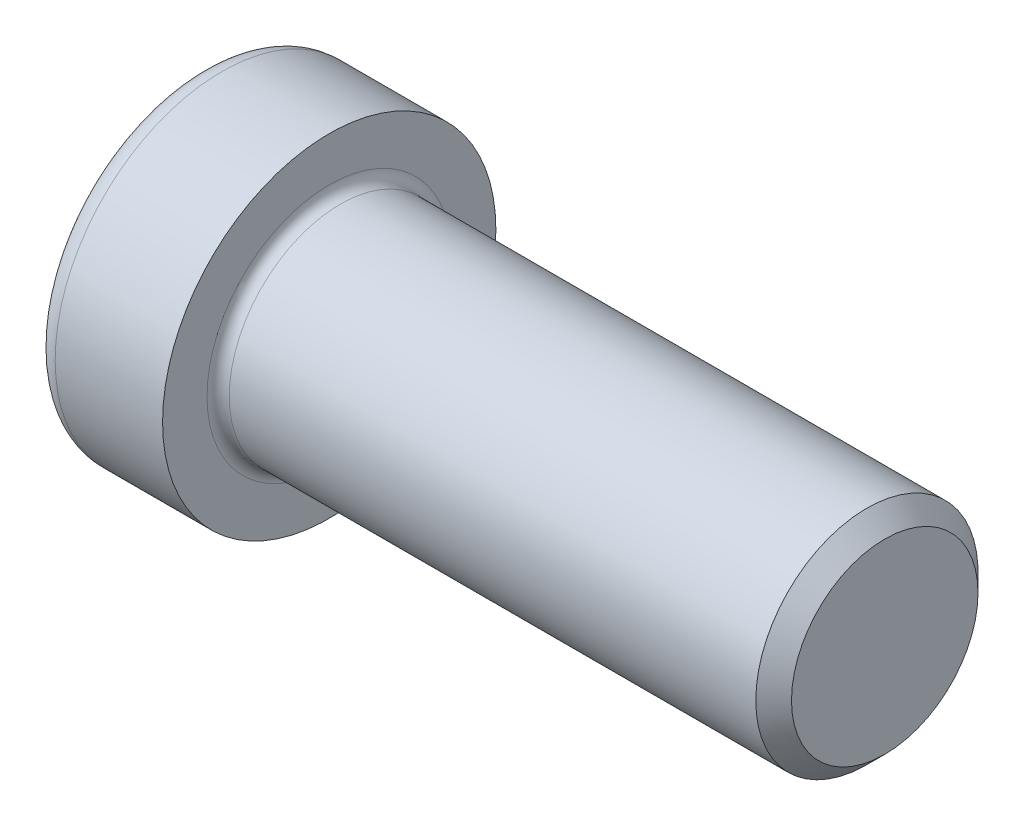
ISO-10303-21;
HEADER;
FILE_DESCRIPTION(('STEP AP214'),'2;1');
FILE_NAME('part.step','',(''),(''),'','','');
FILE_SCHEMA(('AUTOMOTIVE_DESIGN { 1 0 10303 214 1 1 1 1 }'));
ENDSEC;
DATA;
#1=APPLICATION_CONTEXT('core data for automotive mechanical design processes');
#2=APPLICATION_PROTOCOL_DEFINITION('international standard','automotive_design',2000,#1);
#3=PRODUCT_CONTEXT('',#1,'mechanical');
#4=PRODUCT('Part','Part','',(#3));
#5=PRODUCT_RELATED_PRODUCT_CATEGORY('part','',(#4));
#6=PRODUCT_DEFINITION_FORMATION('','',#4);
#7=PRODUCT_DEFINITION_CONTEXT('part definition',#1,'design');
#8=PRODUCT_DEFINITION('design','',#6,#7);
#9=PRODUCT_DEFINITION_SHAPE('','',#8);
#10=(LENGTH_UNIT() NAMED_UNIT(*) SI_UNIT(.MILLI.,.METRE.));
#11=(NAMED_UNIT(*) PLANE_ANGLE_UNIT() SI_UNIT($,.RADIAN.));
#12=(NAMED_UNIT(*) SI_UNIT($,.STERADIAN.) SOLID_ANGLE_UNIT());
#13=UNCERTAINTY_MEASURE_WITH_UNIT(LENGTH_MEASURE(1.E-05),#10,'distance_accuracy_value','');
#14=(GEOMETRIC_REPRESENTATION_CONTEXT(3) GLOBAL_UNCERTAINTY_ASSIGNED_CONTEXT((#13)) GLOBAL_UNIT_ASSIGNED_CONTEXT((#10,
#11,#12)) REPRESENTATION_CONTEXT('',''));
#15=CARTESIAN_POINT('',(0.,0.,0.));
#16=DIRECTION('',(0.,0.,1.));
#17=DIRECTION('',(1.,0.,0.));
#18=AXIS2_PLACEMENT_3D('',#15,#16,#17);
#19=CARTESIAN_POINT('',(0.,0.,0.));
#20=DIRECTION('',(-1.,0.,0.));
#21=DIRECTION('',(0.,0.,1.));
#22=AXIS2_PLACEMENT_3D('',#19,#20,#21);
#23=PLANE('',#22);
#24=DIRECTION('',(0.,-0.499999999999998,0.86602540378444));
#25=VECTOR('',#24,1.);
#26=CARTESIAN_POINT('',(0.,4.61880215351701,0.));
#27=LINE('',#26,#25);
#28=CARTESIAN_POINT('',(0.,4.61880215351701,0.));
#29=VERTEX_POINT('',#28);
#30=CARTESIAN_POINT('',(0.,2.30940107675852,3.99999999999999));
#31=VERTEX_POINT('',#30);
#32=EDGE_CURVE('E412',#29,#31,#27,.T.);
#33=ORIENTED_EDGE('',*,*,#32,.T.);
#34=DIRECTION('',(0.,1.,0.));
#35=VECTOR('',#34,1.);
#36=CARTESIAN_POINT('',(0.,-2.30940107675849,4.));
#37=LINE('',#36,#35);
#38=CARTESIAN_POINT('',(0.,-2.30940107675849,4.));
#39=VERTEX_POINT('',#38);
#40=EDGE_CURVE('E150',#39,#31,#37,.T.);
#41=ORIENTED_EDGE('',*,*,#40,.F.);
#42=DIRECTION('',(0.,-0.500000000000001,-0.866025403784438));
#43=VECTOR('',#42,1.);
#44=CARTESIAN_POINT('',(0.,-2.30940107675849,4.));
#45=LINE('',#44,#43);
#46=CARTESIAN_POINT('',(0.,-4.618802153517,0.));
#47=VERTEX_POINT('',#46);
#48=EDGE_CURVE('E417',#39,#47,#45,.T.);
#49=ORIENTED_EDGE('',*,*,#48,.T.);
#50=DIRECTION('',(0.,0.499999999999998,-0.86602540378444));
#51=VECTOR('',#50,1.);
#52=CARTESIAN_POINT('',(0.,-4.618802153517,0.));
#53=LINE('',#52,#51);
#54=CARTESIAN_POINT('',(0.,-2.3094010767585,-4.));
#55=VERTEX_POINT('',#54);
#56=EDGE_CURVE('E421',#47,#55,#53,.T.);
#57=ORIENTED_EDGE('',*,*,#56,.T.);
#58=DIRECTION('',(0.,-1.,0.));
#59=VECTOR('',#58,1.);
#60=CARTESIAN_POINT('',(0.,2.3094010767585,-4.00000000000001));
#61=LINE('',#60,#59);
#62=CARTESIAN_POINT('',(0.,2.3094010767585,-4.00000000000001));
#63=VERTEX_POINT('',#62);
#64=EDGE_CURVE('E425',#63,#55,#61,.T.);
#65=ORIENTED_EDGE('',*,*,#64,.F.);
#66=DIRECTION('',(0.,-0.500000000000001,-0.866025403784438));
#67=VECTOR('',#66,1.);
#68=CARTESIAN_POINT('',(0.,4.61880215351701,0.));
#69=LINE('',#68,#67);
#70=EDGE_CURVE('E145',#29,#63,#69,.T.);
#71=ORIENTED_EDGE('',*,*,#70,.F.);
#72=EDGE_LOOP('',(#33,#41,#49,#57,#65,#71));
#73=FACE_BOUND('',#72,.T.);
#74=CARTESIAN_POINT('',(0.,0.,0.));
#75=DIRECTION('',(-1.,0.,0.));
#76=DIRECTION('',(0.,0.,1.));
#77=AXIS2_PLACEMENT_3D('',#74,#75,#76);
#78=CIRCLE('',#77,7.8);
#79=CARTESIAN_POINT('',(0.,0.,7.8));
#80=VERTEX_POINT('',#79);
#81=EDGE_CURVE('E60',#80,#80,#78,.T.);
#82=ORIENTED_EDGE('',*,*,#81,.T.);
#83=EDGE_LOOP('',(#82));
#84=FACE_BOUND('',#83,.T.);
#85=ADVANCED_FACE('F51',(#73,#84),#23,.T.);
#86=CARTESIAN_POINT('',(37.,5.036,0.));
#87=DIRECTION('',(1.,0.,0.));
#88=DIRECTION('',(0.,0.,-1.));
#89=AXIS2_PLACEMENT_3D('',#86,#87,#88);
#90=PLANE('',#89);
#91=CARTESIAN_POINT('',(37.,0.,0.));
#92=DIRECTION('',(-1.,0.,0.));
#93=DIRECTION('',(0.,0.,1.));
#94=AXIS2_PLACEMENT_3D('',#91,#92,#93);
#95=CIRCLE('',#94,5.036);
#96=CARTESIAN_POINT('',(37.,0.,5.036));
#97=VERTEX_POINT('',#96);
#98=EDGE_CURVE('E175',#97,#97,#95,.T.);
#99=ORIENTED_EDGE('',*,*,#98,.F.);
#100=EDGE_LOOP('',(#99));
#101=FACE_BOUND('',#100,.T.);
#102=ADVANCED_FACE('F204',(#101),#90,.T.);
#103=CARTESIAN_POINT('',(37.,0.,0.));
#104=DIRECTION('',(-1.,0.,0.));
#105=DIRECTION('',(0.,0.,1.));
#106=AXIS2_PLACEMENT_3D('',#103,#104,#105);
#107=CONICAL_SURFACE('',#106,5.036,0.785398163397072);
#108=CARTESIAN_POINT('',(36.0359999999996,0.,0.));
#109=DIRECTION('',(-1.,0.,0.));
#110=DIRECTION('',(0.,0.,1.));
#111=AXIS2_PLACEMENT_3D('',#108,#109,#110);
#112=CIRCLE('',#111,5.99999999999963);
#113=CARTESIAN_POINT('',(36.0359999999996,0.,5.99999999999963));
#114=VERTEX_POINT('',#113);
#115=EDGE_CURVE('E171',#114,#114,#112,.T.);
#116=ORIENTED_EDGE('',*,*,#115,.F.);
#117=EDGE_LOOP('',(#116));
#118=FACE_BOUND('',#117,.T.);
#119=ORIENTED_EDGE('',*,*,#98,.T.);
#120=EDGE_LOOP('',(#119));
#121=FACE_BOUND('',#120,.T.);
#122=ADVANCED_FACE('F210',(#118,#121),#107,.T.);
#123=CARTESIAN_POINT('',(-31.75,0.,0.));
#124=DIRECTION('',(-1.,0.,0.));
#125=DIRECTION('',(0.,0.,1.));
#126=AXIS2_PLACEMENT_3D('',#123,#124,#125);
#127=CYLINDRICAL_SURFACE('',#126,5.99999999999981);
#128=CARTESIAN_POINT('',(7.6,0.,0.));
#129=DIRECTION('',(1.,0.,0.));
#130=DIRECTION('',(0.,0.,-1.));
#131=AXIS2_PLACEMENT_3D('',#128,#129,#130);
#132=CIRCLE('',#131,5.99999999999981);
#133=CARTESIAN_POINT('',(7.6,0.,-5.99999999999981));
#134=VERTEX_POINT('',#133);
#135=EDGE_CURVE('E183',#134,#134,#132,.T.);
#136=ORIENTED_EDGE('',*,*,#135,.T.);
#137=EDGE_LOOP('',(#136));
#138=FACE_BOUND('',#137,.T.);
#139=ORIENTED_EDGE('',*,*,#115,.T.);
#140=EDGE_LOOP('',(#139));
#141=FACE_BOUND('',#140,.T.);
#142=ADVANCED_FACE('F222',(#138,#141),#127,.T.);
#143=CARTESIAN_POINT('',(7.,9.,0.));
#144=DIRECTION('',(1.,0.,0.));
#145=DIRECTION('',(0.,0.,-1.));
#146=AXIS2_PLACEMENT_3D('',#143,#144,#145);
#147=PLANE('',#146);
#148=CARTESIAN_POINT('',(7.,0.,0.));
#149=DIRECTION('',(1.,0.,0.));
#150=DIRECTION('',(0.,0.,-1.));
#151=AXIS2_PLACEMENT_3D('',#148,#149,#150);
#152=CIRCLE('',#151,6.59999999999981);
#153=CARTESIAN_POINT('',(7.,0.,-6.59999999999981));
#154=VERTEX_POINT('',#153);
#155=EDGE_CURVE('E179',#154,#154,#152,.F.);
#156=ORIENTED_EDGE('',*,*,#155,.T.);
#157=EDGE_LOOP('',(#156));
#158=FACE_BOUND('',#157,.T.);
#159=CARTESIAN_POINT('',(7.,0.,0.));
#160=DIRECTION('',(-1.,0.,0.));
#161=DIRECTION('',(0.,0.,1.));
#162=AXIS2_PLACEMENT_3D('',#159,#160,#161);
#163=CIRCLE('',#162,9.);
#164=CARTESIAN_POINT('',(7.,0.,9.));
#165=VERTEX_POINT('',#164);
#166=EDGE_CURVE('E166',#165,#165,#163,.T.);
#167=ORIENTED_EDGE('',*,*,#166,.F.);
#168=EDGE_LOOP('',(#167));
#169=FACE_BOUND('',#168,.T.);
#170=ADVANCED_FACE('F218',(#158,#169),#147,.T.);
#171=CARTESIAN_POINT('',(-31.75,0.,0.));
#172=DIRECTION('',(-1.,0.,0.));
#173=DIRECTION('',(0.,0.,1.));
#174=AXIS2_PLACEMENT_3D('',#171,#172,#173);
#175=CYLINDRICAL_SURFACE('',#174,9.);
#176=CARTESIAN_POINT('',(1.2,0.,0.));
#177=DIRECTION('',(-1.,0.,0.));
#178=DIRECTION('',(0.,0.,1.));
#179=AXIS2_PLACEMENT_3D('',#176,#177,#178);
#180=CIRCLE('',#179,9.);
#181=CARTESIAN_POINT('',(1.2,0.,9.));
#182=VERTEX_POINT('',#181);
#183=EDGE_CURVE('E11',#182,#182,#180,.F.);
#184=ORIENTED_EDGE('',*,*,#183,.T.);
#185=EDGE_LOOP('',(#184));
#186=FACE_BOUND('',#185,.T.);
#187=ORIENTED_EDGE('',*,*,#166,.T.);
#188=EDGE_LOOP('',(#187));
#189=FACE_BOUND('',#188,.T.);
#190=ADVANCED_FACE('F200',(#186,#189),#175,.T.);
#191=CARTESIAN_POINT('',(7.6,0.,0.));
#192=DIRECTION('',(1.,0.,0.));
#193=DIRECTION('',(0.,0.,-1.));
#194=AXIS2_PLACEMENT_3D('',#191,#192,#193);
#195=TOROIDAL_SURFACE('',#194,6.59999999999981,0.6);
#196=ORIENTED_EDGE('',*,*,#135,.F.);
#197=EDGE_LOOP('',(#196));
#198=FACE_BOUND('',#197,.T.);
#199=ORIENTED_EDGE('',*,*,#155,.F.);
#200=EDGE_LOOP('',(#199));
#201=FACE_BOUND('',#200,.T.);
#202=ADVANCED_FACE('F193',(#198,#201),#195,.F.);
#203=CARTESIAN_POINT('',(1.2,0.,0.));
#204=DIRECTION('',(-1.,0.,0.));
#205=DIRECTION('',(0.,0.,1.));
#206=AXIS2_PLACEMENT_3D('',#203,#204,#205);
#207=TOROIDAL_SURFACE('',#206,7.8,1.2);
#208=ORIENTED_EDGE('',*,*,#183,.F.);
#209=EDGE_LOOP('',(#208));
#210=FACE_BOUND('',#209,.T.);
#211=ORIENTED_EDGE('',*,*,#81,.F.);
#212=EDGE_LOOP('',(#211));
#213=FACE_BOUND('',#212,.T.);
#214=ADVANCED_FACE('F53',(#210,#213),#207,.T.);
#215=CARTESIAN_POINT('',(5.,4.61880215351701,0.));
#216=DIRECTION('',(0.,-0.86602540378444,-0.499999999999998));
#217=DIRECTION('',(0.,0.499999999999998,-0.86602540378444));
#218=AXIS2_PLACEMENT_3D('',#215,#216,#217);
#219=PLANE('',#218);
#220=ORIENTED_EDGE('',*,*,#32,.F.);
#221=DIRECTION('',(-1.,0.,0.));
#222=VECTOR('',#221,1.);
#223=CARTESIAN_POINT('',(5.,4.61880215351701,0.));
#224=LINE('',#223,#222);
#225=CARTESIAN_POINT('',(5.,4.61880215351701,0.));
#226=VERTEX_POINT('',#225);
#227=EDGE_CURVE('E398',#226,#29,#224,.T.);
#228=ORIENTED_EDGE('',*,*,#227,.F.);
#229=DIRECTION('',(0.,-0.499999999999998,0.86602540378444));
#230=VECTOR('',#229,1.);
#231=CARTESIAN_POINT('',(5.,4.61880215351701,0.));
#232=LINE('',#231,#230);
#233=CARTESIAN_POINT('',(5.,3.46410161513776,1.99999999999999));
#234=VERTEX_POINT('',#233);
#235=EDGE_CURVE('E136',#226,#234,#232,.T.);
#236=ORIENTED_EDGE('',*,*,#235,.T.);
#237=CARTESIAN_POINT('',(5.,2.30940107675852,3.99999999999999));
#238=VERTEX_POINT('',#237);
#239=EDGE_CURVE('E126',#234,#238,#232,.T.);
#240=ORIENTED_EDGE('',*,*,#239,.T.);
#241=DIRECTION('',(-1.,0.,0.));
#242=VECTOR('',#241,1.);
#243=CARTESIAN_POINT('',(5.,2.30940107675852,3.99999999999999));
#244=LINE('',#243,#242);
#245=EDGE_CURVE('E141',#238,#31,#244,.T.);
#246=ORIENTED_EDGE('',*,*,#245,.T.);
#247=EDGE_LOOP('',(#220,#228,#236,#240,#246));
#248=FACE_BOUND('',#247,.T.);
#249=ADVANCED_FACE('F140',(#248),#219,.T.);
#250=CARTESIAN_POINT('',(5.,-2.30940107675849,4.));
#251=DIRECTION('',(0.,0.,1.));
#252=DIRECTION('',(0.,-1.,0.));
#253=AXIS2_PLACEMENT_3D('',#250,#251,#252);
#254=PLANE('',#253);
#255=ORIENTED_EDGE('',*,*,#40,.T.);
#256=ORIENTED_EDGE('',*,*,#245,.F.);
#257=DIRECTION('',(0.,1.,0.));
#258=VECTOR('',#257,1.);
#259=CARTESIAN_POINT('',(5.,-2.30940107675849,4.));
#260=LINE('',#259,#258);
#261=CARTESIAN_POINT('',(5.,0.,3.99999999999999));
#262=VERTEX_POINT('',#261);
#263=EDGE_CURVE('E123',#262,#238,#260,.T.);
#264=ORIENTED_EDGE('',*,*,#263,.F.);
#265=CARTESIAN_POINT('',(5.,-2.30940107675849,4.));
#266=VERTEX_POINT('',#265);
#267=EDGE_CURVE('E135',#266,#262,#260,.T.);
#268=ORIENTED_EDGE('',*,*,#267,.F.);
#269=DIRECTION('',(-1.,0.,0.));
#270=VECTOR('',#269,1.);
#271=CARTESIAN_POINT('',(5.,-2.30940107675849,4.));
#272=LINE('',#271,#270);
#273=EDGE_CURVE('E153',#266,#39,#272,.T.);
#274=ORIENTED_EDGE('',*,*,#273,.T.);
#275=EDGE_LOOP('',(#255,#256,#264,#268,#274));
#276=FACE_BOUND('',#275,.T.);
#277=ADVANCED_FACE('F147',(#276),#254,.F.);
#278=CARTESIAN_POINT('',(5.,-2.30940107675849,4.));
#279=DIRECTION('',(0.,0.866025403784438,-0.500000000000001));
#280=DIRECTION('',(0.,0.500000000000001,0.866025403784438));
#281=AXIS2_PLACEMENT_3D('',#278,#279,#280);
#282=PLANE('',#281);
#283=ORIENTED_EDGE('',*,*,#48,.F.);
#284=ORIENTED_EDGE('',*,*,#273,.F.);
#285=DIRECTION('',(0.,-0.500000000000001,-0.866025403784438));
#286=VECTOR('',#285,1.);
#287=CARTESIAN_POINT('',(5.,-2.30940107675849,4.));
#288=LINE('',#287,#286);
#289=CARTESIAN_POINT('',(5.,-3.46410161513774,2.));
#290=VERTEX_POINT('',#289);
#291=EDGE_CURVE('E460',#266,#290,#288,.T.);
#292=ORIENTED_EDGE('',*,*,#291,.T.);
#293=CARTESIAN_POINT('',(5.,-4.618802153517,0.));
#294=VERTEX_POINT('',#293);
#295=EDGE_CURVE('E440',#290,#294,#288,.T.);
#296=ORIENTED_EDGE('',*,*,#295,.T.);
#297=DIRECTION('',(-1.,0.,0.));
#298=VECTOR('',#297,1.);
#299=CARTESIAN_POINT('',(5.,-4.618802153517,0.));
#300=LINE('',#299,#298);
#301=EDGE_CURVE('E161',#294,#47,#300,.T.);
#302=ORIENTED_EDGE('',*,*,#301,.T.);
#303=EDGE_LOOP('',(#283,#284,#292,#296,#302));
#304=FACE_BOUND('',#303,.T.);
#305=ADVANCED_FACE('F287',(#304),#282,.T.);
#306=CARTESIAN_POINT('',(5.,-4.618802153517,0.));
#307=DIRECTION('',(0.,0.86602540378444,0.499999999999998));
#308=DIRECTION('',(0.,-0.499999999999998,0.86602540378444));
#309=AXIS2_PLACEMENT_3D('',#306,#307,#308);
#310=PLANE('',#309);
#311=ORIENTED_EDGE('',*,*,#56,.F.);
#312=ORIENTED_EDGE('',*,*,#301,.F.);
#313=DIRECTION('',(0.,0.499999999999998,-0.86602540378444));
#314=VECTOR('',#313,1.);
#315=CARTESIAN_POINT('',(5.,-4.618802153517,0.));
#316=LINE('',#315,#314);
#317=CARTESIAN_POINT('',(5.,-3.46410161513776,-1.99999999999999));
#318=VERTEX_POINT('',#317);
#319=EDGE_CURVE('E407',#294,#318,#316,.T.);
#320=ORIENTED_EDGE('',*,*,#319,.T.);
#321=CARTESIAN_POINT('',(5.,-2.3094010767585,-4.));
#322=VERTEX_POINT('',#321);
#323=EDGE_CURVE('E458',#318,#322,#316,.T.);
#324=ORIENTED_EDGE('',*,*,#323,.T.);
#325=DIRECTION('',(-1.,0.,0.));
#326=VECTOR('',#325,1.);
#327=CARTESIAN_POINT('',(5.,-2.3094010767585,-4.));
#328=LINE('',#327,#326);
#329=EDGE_CURVE('E397',#322,#55,#328,.T.);
#330=ORIENTED_EDGE('',*,*,#329,.T.);
#331=EDGE_LOOP('',(#311,#312,#320,#324,#330));
#332=FACE_BOUND('',#331,.T.);
#333=ADVANCED_FACE('F295',(#332),#310,.T.);
#334=CARTESIAN_POINT('',(5.,2.3094010767585,-4.00000000000001));
#335=DIRECTION('',(0.,0.,-1.));
#336=DIRECTION('',(0.,1.,0.));
#337=AXIS2_PLACEMENT_3D('',#334,#335,#336);
#338=PLANE('',#337);
#339=ORIENTED_EDGE('',*,*,#64,.T.);
#340=ORIENTED_EDGE('',*,*,#329,.F.);
#341=DIRECTION('',(0.,-1.,0.));
#342=VECTOR('',#341,1.);
#343=CARTESIAN_POINT('',(5.,2.3094010767585,-4.00000000000001));
#344=LINE('',#343,#342);
#345=CARTESIAN_POINT('',(5.,0.,-4.));
#346=VERTEX_POINT('',#345);
#347=EDGE_CURVE('E401',#346,#322,#344,.T.);
#348=ORIENTED_EDGE('',*,*,#347,.F.);
#349=CARTESIAN_POINT('',(5.,2.3094010767585,-4.00000000000001));
#350=VERTEX_POINT('',#349);
#351=EDGE_CURVE('E67',#350,#346,#344,.T.);
#352=ORIENTED_EDGE('',*,*,#351,.F.);
#353=DIRECTION('',(-1.,0.,0.));
#354=VECTOR('',#353,1.);
#355=CARTESIAN_POINT('',(5.,2.3094010767585,-4.00000000000001));
#356=LINE('',#355,#354);
#357=EDGE_CURVE('E393',#350,#63,#356,.T.);
#358=ORIENTED_EDGE('',*,*,#357,.T.);
#359=EDGE_LOOP('',(#339,#340,#348,#352,#358));
#360=FACE_BOUND('',#359,.T.);
#361=ADVANCED_FACE('F304',(#360),#338,.F.);
#362=CARTESIAN_POINT('',(5.,4.61880215351701,0.));
#363=DIRECTION('',(0.,0.866025403784438,-0.500000000000001));
#364=DIRECTION('',(0.,0.500000000000001,0.866025403784438));
#365=AXIS2_PLACEMENT_3D('',#362,#363,#364);
#366=PLANE('',#365);
#367=ORIENTED_EDGE('',*,*,#70,.T.);
#368=ORIENTED_EDGE('',*,*,#357,.F.);
#369=DIRECTION('',(0.,-0.500000000000001,-0.866025403784438));
#370=VECTOR('',#369,1.);
#371=CARTESIAN_POINT('',(5.,4.61880215351701,0.));
#372=LINE('',#371,#370);
#373=CARTESIAN_POINT('',(5.,3.46410161513776,-2.00000000000001));
#374=VERTEX_POINT('',#373);
#375=EDGE_CURVE('E382',#374,#350,#372,.T.);
#376=ORIENTED_EDGE('',*,*,#375,.F.);
#377=EDGE_CURVE('E389',#226,#374,#372,.T.);
#378=ORIENTED_EDGE('',*,*,#377,.F.);
#379=ORIENTED_EDGE('',*,*,#227,.T.);
#380=EDGE_LOOP('',(#367,#368,#376,#378,#379));
#381=FACE_BOUND('',#380,.T.);
#382=ADVANCED_FACE('F313',(#381),#366,.F.);
#383=CARTESIAN_POINT('',(5.,6.9282032302755,-4.00000000000001));
#384=DIRECTION('',(1.,0.,0.));
#385=DIRECTION('',(0.,0.,-1.));
#386=AXIS2_PLACEMENT_3D('',#383,#384,#385);
#387=PLANE('',#386);
#388=ORIENTED_EDGE('',*,*,#347,.T.);
#389=ORIENTED_EDGE('',*,*,#323,.F.);
#390=CARTESIAN_POINT('',(5.,0.,0.));
#391=DIRECTION('',(-1.,0.,0.));
#392=DIRECTION('',(0.,0.,1.));
#393=AXIS2_PLACEMENT_3D('',#390,#391,#392);
#394=CIRCLE('',#393,4.);
#395=EDGE_CURVE('E449',#346,#318,#394,.T.);
#396=ORIENTED_EDGE('',*,*,#395,.F.);
#397=EDGE_LOOP('',(#388,#389,#396));
#398=FACE_BOUND('',#397,.T.);
#399=ADVANCED_FACE('F322',(#398),#387,.F.);
#400=ORIENTED_EDGE('',*,*,#319,.F.);
#401=ORIENTED_EDGE('',*,*,#295,.F.);
#402=EDGE_CURVE('E159',#318,#290,#394,.T.);
#403=ORIENTED_EDGE('',*,*,#402,.F.);
#404=EDGE_LOOP('',(#400,#401,#403));
#405=FACE_BOUND('',#404,.T.);
#406=ADVANCED_FACE('F331',(#405),#387,.F.);
#407=ORIENTED_EDGE('',*,*,#291,.F.);
#408=ORIENTED_EDGE('',*,*,#267,.T.);
#409=EDGE_CURVE('E152',#290,#262,#394,.T.);
#410=ORIENTED_EDGE('',*,*,#409,.F.);
#411=EDGE_LOOP('',(#407,#408,#410));
#412=FACE_BOUND('',#411,.T.);
#413=ADVANCED_FACE('F340',(#412),#387,.F.);
#414=ORIENTED_EDGE('',*,*,#263,.T.);
#415=ORIENTED_EDGE('',*,*,#239,.F.);
#416=EDGE_CURVE('E129',#262,#234,#394,.T.);
#417=ORIENTED_EDGE('',*,*,#416,.F.);
#418=EDGE_LOOP('',(#414,#415,#417));
#419=FACE_BOUND('',#418,.T.);
#420=ADVANCED_FACE('F125',(#419),#387,.F.);
#421=ORIENTED_EDGE('',*,*,#235,.F.);
#422=ORIENTED_EDGE('',*,*,#377,.T.);
#423=EDGE_CURVE('E167',#234,#374,#394,.T.);
#424=ORIENTED_EDGE('',*,*,#423,.F.);
#425=EDGE_LOOP('',(#421,#422,#424));
#426=FACE_BOUND('',#425,.T.);
#427=ADVANCED_FACE('F355',(#426),#387,.F.);
#428=ORIENTED_EDGE('',*,*,#375,.T.);
#429=ORIENTED_EDGE('',*,*,#351,.T.);
#430=EDGE_CURVE('E385',#374,#346,#394,.T.);
#431=ORIENTED_EDGE('',*,*,#430,.F.);
#432=EDGE_LOOP('',(#428,#429,#431));
#433=FACE_BOUND('',#432,.T.);
#434=ADVANCED_FACE('F270',(#433),#387,.F.);
#435=CARTESIAN_POINT('',(5.,0.,0.));
#436=DIRECTION('',(-1.,0.,0.));
#437=DIRECTION('',(0.,0.,1.));
#438=AXIS2_PLACEMENT_3D('',#435,#436,#437);
#439=CONICAL_SURFACE('',#438,4.,1.04719755119659);
#440=CARTESIAN_POINT('',(7.30940107675852,0.,0.));
#441=VERTEX_POINT('',#440);
#442=VERTEX_LOOP('',#441);
#443=FACE_BOUND('',#442,.T.);
#444=ORIENTED_EDGE('',*,*,#416,.T.);
#445=ORIENTED_EDGE('',*,*,#423,.T.);
#446=ORIENTED_EDGE('',*,*,#430,.T.);
#447=ORIENTED_EDGE('',*,*,#395,.T.);
#448=ORIENTED_EDGE('',*,*,#402,.T.);
#449=ORIENTED_EDGE('',*,*,#409,.T.);
#450=EDGE_LOOP('',(#444,#445,#446,#447,#448,#449));
#451=FACE_BOUND('',#450,.T.);
#452=ADVANCED_FACE('F215',(#443,#451),#439,.F.);
#453=CLOSED_SHELL('',(#85,#102,#122,#142,#170,#190,#202,#214,#249,#277,#305,#333,#361,#382,#399,
#406,#413,#420,#427,#434,#452));
#454=MANIFOLD_SOLID_BREP('B2',#453);
#455=ADVANCED_BREP_SHAPE_REPRESENTATION('',(#18,#454),#14);
#456=SHAPE_DEFINITION_REPRESENTATION(#9,#455);
ENDSEC;
END-ISO-10303-21;
